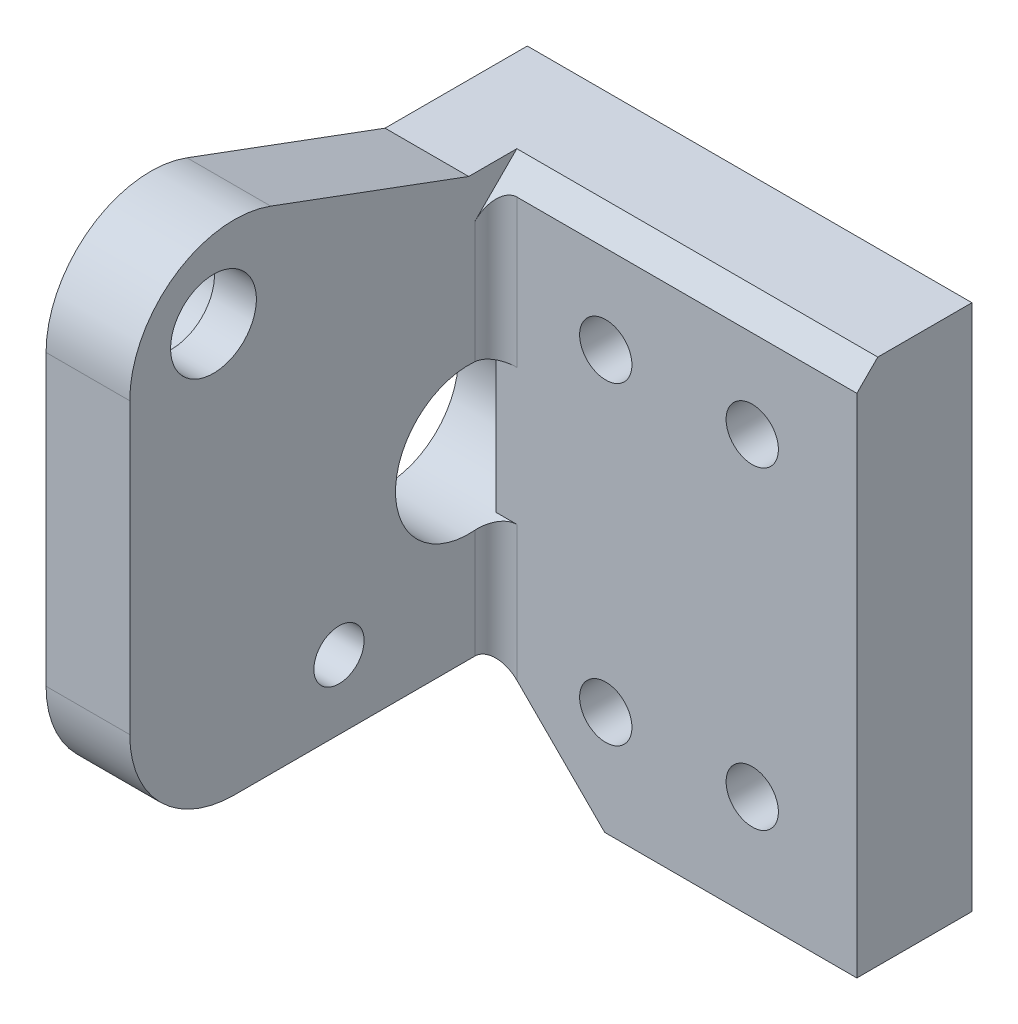
ISO-10303-21;
HEADER;
FILE_DESCRIPTION(('STEP AP214'),'2;1');
FILE_NAME('part.step','',(''),(''),'','','');
FILE_SCHEMA(('AUTOMOTIVE_DESIGN { 1 0 10303 214 1 1 1 1 }'));
ENDSEC;
DATA;
#1=APPLICATION_CONTEXT('core data for automotive mechanical design processes');
#2=APPLICATION_PROTOCOL_DEFINITION('international standard','automotive_design',2000,#1);
#3=PRODUCT_CONTEXT('',#1,'mechanical');
#4=PRODUCT('Part','Part','',(#3));
#5=PRODUCT_RELATED_PRODUCT_CATEGORY('part','',(#4));
#6=PRODUCT_DEFINITION_FORMATION('','',#4);
#7=PRODUCT_DEFINITION_CONTEXT('part definition',#1,'design');
#8=PRODUCT_DEFINITION('design','',#6,#7);
#9=PRODUCT_DEFINITION_SHAPE('','',#8);
#10=(LENGTH_UNIT() NAMED_UNIT(*) SI_UNIT(.MILLI.,.METRE.));
#11=(NAMED_UNIT(*) PLANE_ANGLE_UNIT() SI_UNIT($,.RADIAN.));
#12=(NAMED_UNIT(*) SI_UNIT($,.STERADIAN.) SOLID_ANGLE_UNIT());
#13=UNCERTAINTY_MEASURE_WITH_UNIT(LENGTH_MEASURE(1.E-05),#10,'distance_accuracy_value','');
#14=(GEOMETRIC_REPRESENTATION_CONTEXT(3) GLOBAL_UNCERTAINTY_ASSIGNED_CONTEXT((#13)) GLOBAL_UNIT_ASSIGNED_CONTEXT((#10,
#11,#12)) REPRESENTATION_CONTEXT('',''));
#15=CARTESIAN_POINT('',(0.,0.,0.));
#16=DIRECTION('',(0.,0.,1.));
#17=DIRECTION('',(1.,0.,0.));
#18=AXIS2_PLACEMENT_3D('',#15,#16,#17);
#19=CARTESIAN_POINT('',(-34.75,-12.,10.5));
#20=DIRECTION('',(0.,1.,0.));
#21=DIRECTION('',(0.,0.,1.));
#22=AXIS2_PLACEMENT_3D('',#19,#20,#21);
#23=PLANE('',#22);
#24=DIRECTION('',(0.,0.,1.));
#25=VECTOR('',#24,1.);
#26=CARTESIAN_POINT('',(-17.5,-12.,-61.));
#27=LINE('',#26,#25);
#28=CARTESIAN_POINT('',(-17.5,-12.,0.));
#29=VERTEX_POINT('',#28);
#30=CARTESIAN_POINT('',(-17.5,-12.,5.5));
#31=VERTEX_POINT('',#30);
#32=EDGE_CURVE('E170',#29,#31,#27,.T.);
#33=ORIENTED_EDGE('',*,*,#32,.T.);
#34=DIRECTION('',(1.,0.,0.));
#35=VECTOR('',#34,1.);
#36=CARTESIAN_POINT('',(-34.75,-12.,5.5));
#37=LINE('',#36,#35);
#38=CARTESIAN_POINT('',(-29.55,-12.,5.5));
#39=VERTEX_POINT('',#38);
#40=EDGE_CURVE('E150',#39,#31,#37,.T.);
#41=ORIENTED_EDGE('',*,*,#40,.F.);
#42=DIRECTION('',(0.,0.,-1.));
#43=VECTOR('',#42,1.);
#44=CARTESIAN_POINT('',(-29.55,-12.,10.5));
#45=LINE('',#44,#43);
#46=CARTESIAN_POINT('',(-29.55,-12.,0.));
#47=VERTEX_POINT('',#46);
#48=EDGE_CURVE('E179',#39,#47,#45,.T.);
#49=ORIENTED_EDGE('',*,*,#48,.T.);
#50=DIRECTION('',(1.,0.,0.));
#51=VECTOR('',#50,1.);
#52=CARTESIAN_POINT('',(-34.75,-12.,0.));
#53=LINE('',#52,#51);
#54=EDGE_CURVE('E178',#47,#29,#53,.T.);
#55=ORIENTED_EDGE('',*,*,#54,.T.);
#56=EDGE_LOOP('',(#33,#41,#49,#55));
#57=FACE_BOUND('',#56,.T.);
#58=ADVANCED_FACE('F38',(#57),#23,.F.);
#59=CARTESIAN_POINT('',(-34.75,13.2,10.5));
#60=DIRECTION('',(0.,-1.,0.));
#61=DIRECTION('',(0.,0.,-1.));
#62=AXIS2_PLACEMENT_3D('',#59,#60,#61);
#63=PLANE('',#62);
#64=DIRECTION('',(0.,0.,-1.));
#65=VECTOR('',#64,1.);
#66=CARTESIAN_POINT('',(-34.75,13.2000000000001,0.));
#67=LINE('',#66,#65);
#68=CARTESIAN_POINT('',(-34.75,13.2000000000001,6.79999999999993));
#69=VERTEX_POINT('',#68);
#70=CARTESIAN_POINT('',(-34.75,13.2,4.49999999999999));
#71=VERTEX_POINT('',#70);
#72=EDGE_CURVE('E388',#69,#71,#67,.T.);
#73=ORIENTED_EDGE('',*,*,#72,.T.);
#74=DIRECTION('',(1.,0.,0.));
#75=VECTOR('',#74,1.);
#76=CARTESIAN_POINT('',(-17.5,13.2,4.49999999999999));
#77=LINE('',#76,#75);
#78=CARTESIAN_POINT('',(-17.5,13.2,4.49999999999999));
#79=VERTEX_POINT('',#78);
#80=EDGE_CURVE('E223',#71,#79,#77,.T.);
#81=ORIENTED_EDGE('',*,*,#80,.T.);
#82=DIRECTION('',(0.,0.,-1.));
#83=VECTOR('',#82,1.);
#84=CARTESIAN_POINT('',(-17.5,13.2,10.5));
#85=LINE('',#84,#83);
#86=CARTESIAN_POINT('',(-17.5,13.2,0.));
#87=VERTEX_POINT('',#86);
#88=EDGE_CURVE('E411',#79,#87,#85,.T.);
#89=ORIENTED_EDGE('',*,*,#88,.T.);
#90=DIRECTION('',(1.,0.,0.));
#91=VECTOR('',#90,1.);
#92=CARTESIAN_POINT('',(-34.75,13.2,0.));
#93=LINE('',#92,#91);
#94=CARTESIAN_POINT('',(-38.75,13.2000000000001,0.));
#95=VERTEX_POINT('',#94);
#96=EDGE_CURVE('E191',#95,#87,#93,.T.);
#97=ORIENTED_EDGE('',*,*,#96,.F.);
#98=DIRECTION('',(0.,0.,-1.));
#99=VECTOR('',#98,1.);
#100=CARTESIAN_POINT('',(-38.75,13.2000000000001,0.));
#101=LINE('',#100,#99);
#102=CARTESIAN_POINT('',(-38.75,13.2000000000001,6.79999999999993));
#103=VERTEX_POINT('',#102);
#104=EDGE_CURVE('E393',#103,#95,#101,.T.);
#105=ORIENTED_EDGE('',*,*,#104,.F.);
#106=DIRECTION('',(1.,0.,0.));
#107=VECTOR('',#106,1.);
#108=CARTESIAN_POINT('',(-38.75,13.2000000000001,6.79999999999993));
#109=LINE('',#108,#107);
#110=EDGE_CURVE('E370',#103,#69,#109,.T.);
#111=ORIENTED_EDGE('',*,*,#110,.T.);
#112=EDGE_LOOP('',(#73,#81,#89,#97,#105,#111));
#113=FACE_BOUND('',#112,.T.);
#114=ADVANCED_FACE('F320',(#113),#63,.F.);
#115=CARTESIAN_POINT('',(-17.5,47.1283361405006,0.));
#116=DIRECTION('',(-1.,0.,0.));
#117=DIRECTION('',(0.,-1.,0.));
#118=AXIS2_PLACEMENT_3D('',#115,#116,#117);
#119=PLANE('',#118);
#120=ORIENTED_EDGE('',*,*,#88,.F.);
#121=DIRECTION('',(0.,-0.707106781186548,0.707106781186548));
#122=VECTOR('',#121,1.);
#123=CARTESIAN_POINT('',(-17.5,12.2,5.5));
#124=LINE('',#123,#122);
#125=CARTESIAN_POINT('',(-17.5,12.2,5.5));
#126=VERTEX_POINT('',#125);
#127=EDGE_CURVE('E173',#79,#126,#124,.T.);
#128=ORIENTED_EDGE('',*,*,#127,.T.);
#129=DIRECTION('',(0.,1.,0.));
#130=VECTOR('',#129,1.);
#131=CARTESIAN_POINT('',(-17.5,47.1283361405006,5.5));
#132=LINE('',#131,#130);
#133=EDGE_CURVE('E155',#31,#126,#132,.T.);
#134=ORIENTED_EDGE('',*,*,#133,.F.);
#135=ORIENTED_EDGE('',*,*,#32,.F.);
#136=DIRECTION('',(0.,-1.,0.));
#137=VECTOR('',#136,1.);
#138=CARTESIAN_POINT('',(-17.5,-12.,0.));
#139=LINE('',#138,#137);
#140=EDGE_CURVE('E187',#87,#29,#139,.T.);
#141=ORIENTED_EDGE('',*,*,#140,.F.);
#142=EDGE_LOOP('',(#120,#128,#134,#135,#141));
#143=FACE_BOUND('',#142,.T.);
#144=ADVANCED_FACE('F168',(#143),#119,.F.);
#145=CARTESIAN_POINT('',(-22.5,7.99999999999999,0.));
#146=DIRECTION('',(0.,0.,-1.));
#147=DIRECTION('',(-1.,0.,0.));
#148=AXIS2_PLACEMENT_3D('',#145,#146,#147);
#149=CYLINDRICAL_SURFACE('',#148,1.24999999999999);
#150=CARTESIAN_POINT('',(-22.5,7.99999999999999,0.499999999999998));
#151=DIRECTION('',(0.,0.,1.));
#152=DIRECTION('',(1.,0.,0.));
#153=AXIS2_PLACEMENT_3D('',#150,#151,#152);
#154=CIRCLE('',#153,1.24999999999999);
#155=CARTESIAN_POINT('',(-21.25,7.99999999999999,0.499999999999998));
#156=VERTEX_POINT('',#155);
#157=EDGE_CURVE('E430',#156,#156,#154,.F.);
#158=ORIENTED_EDGE('',*,*,#157,.T.);
#159=EDGE_LOOP('',(#158));
#160=FACE_BOUND('',#159,.T.);
#161=CARTESIAN_POINT('',(-22.5,7.99999999999999,5.5));
#162=DIRECTION('',(0.,0.,1.));
#163=DIRECTION('',(1.,0.,0.));
#164=AXIS2_PLACEMENT_3D('',#161,#162,#163);
#165=CIRCLE('',#164,1.24999999999999);
#166=CARTESIAN_POINT('',(-21.25,7.99999999999999,5.5));
#167=VERTEX_POINT('',#166);
#168=EDGE_CURVE('E442',#167,#167,#165,.F.);
#169=ORIENTED_EDGE('',*,*,#168,.F.);
#170=EDGE_LOOP('',(#169));
#171=FACE_BOUND('',#170,.T.);
#172=ADVANCED_FACE('F319',(#160,#171),#149,.F.);
#173=CARTESIAN_POINT('',(-22.5,-7.00000000000001,0.));
#174=DIRECTION('',(0.,0.,-1.));
#175=DIRECTION('',(-1.,0.,0.));
#176=AXIS2_PLACEMENT_3D('',#173,#174,#175);
#177=CYLINDRICAL_SURFACE('',#176,1.24999999999999);
#178=CARTESIAN_POINT('',(-22.5,-7.00000000000001,0.499999999999996));
#179=DIRECTION('',(0.,0.,1.));
#180=DIRECTION('',(1.,0.,0.));
#181=AXIS2_PLACEMENT_3D('',#178,#179,#180);
#182=CIRCLE('',#181,1.24999999999999);
#183=CARTESIAN_POINT('',(-21.25,-7.00000000000001,0.499999999999996));
#184=VERTEX_POINT('',#183);
#185=EDGE_CURVE('E197',#184,#184,#182,.F.);
#186=ORIENTED_EDGE('',*,*,#185,.T.);
#187=EDGE_LOOP('',(#186));
#188=FACE_BOUND('',#187,.T.);
#189=CARTESIAN_POINT('',(-22.5,-7.00000000000001,5.5));
#190=DIRECTION('',(0.,0.,1.));
#191=DIRECTION('',(1.,0.,0.));
#192=AXIS2_PLACEMENT_3D('',#189,#190,#191);
#193=CIRCLE('',#192,1.24999999999999);
#194=CARTESIAN_POINT('',(-21.25,-7.00000000000001,5.5));
#195=VERTEX_POINT('',#194);
#196=EDGE_CURVE('E174',#195,#195,#193,.F.);
#197=ORIENTED_EDGE('',*,*,#196,.F.);
#198=EDGE_LOOP('',(#197));
#199=FACE_BOUND('',#198,.T.);
#200=ADVANCED_FACE('F267',(#188,#199),#177,.F.);
#201=CARTESIAN_POINT('',(-38.75,13.2000000000001,18.9999999999999));
#202=DIRECTION('',(1.,0.,0.));
#203=DIRECTION('',(0.,0.,-1.));
#204=AXIS2_PLACEMENT_3D('',#201,#202,#203);
#205=CYLINDRICAL_SURFACE('',#204,2.04999999999995);
#206=CARTESIAN_POINT('',(-34.75,13.2000000000001,18.9999999999999));
#207=DIRECTION('',(-1.,0.,0.));
#208=DIRECTION('',(0.,0.,1.));
#209=AXIS2_PLACEMENT_3D('',#206,#207,#208);
#210=CIRCLE('',#209,2.04999999999995);
#211=CARTESIAN_POINT('',(-34.75,13.2000000000001,21.0499999999999));
#212=VERTEX_POINT('',#211);
#213=EDGE_CURVE('E376',#212,#212,#210,.T.);
#214=ORIENTED_EDGE('',*,*,#213,.F.);
#215=EDGE_LOOP('',(#214));
#216=FACE_BOUND('',#215,.T.);
#217=CARTESIAN_POINT('',(-36.75,13.2000000000001,18.9999999999999));
#218=DIRECTION('',(-1.,0.,0.));
#219=DIRECTION('',(0.,0.,1.));
#220=AXIS2_PLACEMENT_3D('',#217,#218,#219);
#221=CIRCLE('',#220,2.04999999999995);
#222=CARTESIAN_POINT('',(-36.75,13.2000000000001,21.0499999999999));
#223=VERTEX_POINT('',#222);
#224=EDGE_CURVE('E217',#223,#223,#221,.T.);
#225=ORIENTED_EDGE('',*,*,#224,.T.);
#226=EDGE_LOOP('',(#225));
#227=FACE_BOUND('',#226,.T.);
#228=ADVANCED_FACE('F262',(#216,#227),#205,.F.);
#229=CARTESIAN_POINT('',(-34.75,12.,10.5));
#230=DIRECTION('',(1.,0.,0.));
#231=DIRECTION('',(0.,0.,-1.));
#232=AXIS2_PLACEMENT_3D('',#229,#230,#231);
#233=PLANE('',#232);
#234=DIRECTION('',(0.,-1.,0.));
#235=VECTOR('',#234,1.);
#236=CARTESIAN_POINT('',(-34.75,12.,5.5));
#237=LINE('',#236,#235);
#238=CARTESIAN_POINT('',(-34.75,5.14961536185445,5.5));
#239=VERTEX_POINT('',#238);
#240=CARTESIAN_POINT('',(-34.75,-1.34961536185431,5.5));
#241=VERTEX_POINT('',#240);
#242=EDGE_CURVE('E164',#239,#241,#237,.T.);
#243=ORIENTED_EDGE('',*,*,#242,.F.);
#244=CARTESIAN_POINT('',(-34.75,1.90000000000007,6.79999999999993));
#245=DIRECTION('',(-1.,0.,0.));
#246=DIRECTION('',(0.,0.,1.));
#247=AXIS2_PLACEMENT_3D('',#244,#245,#246);
#248=CIRCLE('',#247,3.49999999999997);
#249=EDGE_CURVE('E367',#239,#241,#248,.T.);
#250=ORIENTED_EDGE('',*,*,#249,.T.);
#251=EDGE_LOOP('',(#243,#250));
#252=FACE_BOUND('',#251,.T.);
#253=ADVANCED_FACE('F266',(#252),#233,.F.);
#254=CARTESIAN_POINT('',(-29.5,7.99999999999998,0.));
#255=DIRECTION('',(0.,0.,-1.));
#256=DIRECTION('',(-1.,0.,0.));
#257=AXIS2_PLACEMENT_3D('',#254,#255,#256);
#258=CYLINDRICAL_SURFACE('',#257,1.24999999999999);
#259=CARTESIAN_POINT('',(-29.5,7.99999999999998,0.499999999999998));
#260=DIRECTION('',(0.,0.,1.));
#261=DIRECTION('',(1.,0.,0.));
#262=AXIS2_PLACEMENT_3D('',#259,#260,#261);
#263=CIRCLE('',#262,1.24999999999999);
#264=CARTESIAN_POINT('',(-28.25,7.99999999999998,0.499999999999998));
#265=VERTEX_POINT('',#264);
#266=EDGE_CURVE('E416',#265,#265,#263,.F.);
#267=ORIENTED_EDGE('',*,*,#266,.T.);
#268=EDGE_LOOP('',(#267));
#269=FACE_BOUND('',#268,.T.);
#270=CARTESIAN_POINT('',(-29.5,7.99999999999998,5.5));
#271=DIRECTION('',(0.,0.,1.));
#272=DIRECTION('',(1.,0.,0.));
#273=AXIS2_PLACEMENT_3D('',#270,#271,#272);
#274=CIRCLE('',#273,1.24999999999999);
#275=CARTESIAN_POINT('',(-28.25,7.99999999999998,5.5));
#276=VERTEX_POINT('',#275);
#277=EDGE_CURVE('E180',#276,#276,#274,.F.);
#278=ORIENTED_EDGE('',*,*,#277,.F.);
#279=EDGE_LOOP('',(#278));
#280=FACE_BOUND('',#279,.T.);
#281=ADVANCED_FACE('F315',(#269,#280),#258,.F.);
#282=CARTESIAN_POINT('',(-29.5,-7.00000000000001,0.));
#283=DIRECTION('',(0.,0.,-1.));
#284=DIRECTION('',(-1.,0.,0.));
#285=AXIS2_PLACEMENT_3D('',#282,#283,#284);
#286=CYLINDRICAL_SURFACE('',#285,1.24999999999999);
#287=CARTESIAN_POINT('',(-29.5,-7.00000000000001,0.499999999999998));
#288=DIRECTION('',(0.,0.,1.));
#289=DIRECTION('',(1.,0.,0.));
#290=AXIS2_PLACEMENT_3D('',#287,#288,#289);
#291=CIRCLE('',#290,1.24999999999999);
#292=CARTESIAN_POINT('',(-28.25,-7.00000000000001,0.499999999999998));
#293=VERTEX_POINT('',#292);
#294=EDGE_CURVE('E421',#293,#293,#291,.F.);
#295=ORIENTED_EDGE('',*,*,#294,.T.);
#296=EDGE_LOOP('',(#295));
#297=FACE_BOUND('',#296,.T.);
#298=CARTESIAN_POINT('',(-29.5,-7.00000000000001,5.5));
#299=DIRECTION('',(0.,0.,1.));
#300=DIRECTION('',(1.,0.,0.));
#301=AXIS2_PLACEMENT_3D('',#298,#299,#300);
#302=CIRCLE('',#301,1.24999999999999);
#303=CARTESIAN_POINT('',(-28.25,-7.00000000000001,5.5));
#304=VERTEX_POINT('',#303);
#305=EDGE_CURVE('E163',#304,#304,#302,.F.);
#306=ORIENTED_EDGE('',*,*,#305,.F.);
#307=EDGE_LOOP('',(#306));
#308=FACE_BOUND('',#307,.T.);
#309=ADVANCED_FACE('F296',(#297,#308),#286,.F.);
#310=CARTESIAN_POINT('',(-29.55,-12.,10.5));
#311=DIRECTION('',(0.707106781186549,0.707106781186546,0.));
#312=DIRECTION('',(-0.707106781186546,0.707106781186549,0.));
#313=AXIS2_PLACEMENT_3D('',#310,#311,#312);
#314=PLANE('',#313);
#315=ORIENTED_EDGE('',*,*,#48,.F.);
#316=DIRECTION('',(0.707106781186546,-0.707106781186549,0.));
#317=VECTOR('',#316,1.);
#318=CARTESIAN_POINT('',(-29.55,-12.,5.5));
#319=LINE('',#318,#317);
#320=CARTESIAN_POINT('',(-33.75,-7.79999999999999,5.5));
#321=VERTEX_POINT('',#320);
#322=EDGE_CURVE('E159',#39,#321,#319,.F.);
#323=ORIENTED_EDGE('',*,*,#322,.T.);
#324=CARTESIAN_POINT('',(-33.75,-7.79999999999999,6.5));
#325=DIRECTION('',(0.707106781186549,0.707106781186546,0.));
#326=DIRECTION('',(-0.707106781186546,0.707106781186549,0.));
#327=AXIS2_PLACEMENT_3D('',#324,#325,#326);
#328=ELLIPSE('',#327,1.4142135623731,1.);
#329=CARTESIAN_POINT('',(-34.75,-6.79999999999993,6.5));
#330=VERTEX_POINT('',#329);
#331=EDGE_CURVE('E53',#321,#330,#328,.T.);
#332=ORIENTED_EDGE('',*,*,#331,.T.);
#333=DIRECTION('',(0.,0.,1.));
#334=VECTOR('',#333,1.);
#335=CARTESIAN_POINT('',(-34.75,-6.79999999999998,10.5));
#336=LINE('',#335,#334);
#337=CARTESIAN_POINT('',(-34.75,-6.79999999999993,0.));
#338=VERTEX_POINT('',#337);
#339=EDGE_CURVE('E413',#338,#330,#336,.T.);
#340=ORIENTED_EDGE('',*,*,#339,.F.);
#341=DIRECTION('',(0.707106781186546,-0.707106781186549,0.));
#342=VECTOR('',#341,1.);
#343=CARTESIAN_POINT('',(-29.55,-12.,0.));
#344=LINE('',#343,#342);
#345=EDGE_CURVE('E414',#47,#338,#344,.F.);
#346=ORIENTED_EDGE('',*,*,#345,.F.);
#347=EDGE_LOOP('',(#315,#323,#332,#340,#346));
#348=FACE_BOUND('',#347,.T.);
#349=ADVANCED_FACE('F292',(#348),#314,.F.);
#350=CARTESIAN_POINT('',(-34.75,-12.,0.));
#351=DIRECTION('',(0.,0.,1.));
#352=DIRECTION('',(1.,0.,0.));
#353=AXIS2_PLACEMENT_3D('',#350,#351,#352);
#354=PLANE('',#353);
#355=CARTESIAN_POINT('',(-22.5,-7.00000000000001,0.));
#356=DIRECTION('',(0.,0.,1.));
#357=DIRECTION('',(1.,0.,0.));
#358=AXIS2_PLACEMENT_3D('',#355,#356,#357);
#359=CIRCLE('',#358,1.74999999999999);
#360=CARTESIAN_POINT('',(-20.75,-7.00000000000001,0.));
#361=VERTEX_POINT('',#360);
#362=EDGE_CURVE('E190',#361,#361,#359,.T.);
#363=ORIENTED_EDGE('',*,*,#362,.T.);
#364=EDGE_LOOP('',(#363));
#365=FACE_BOUND('',#364,.T.);
#366=CARTESIAN_POINT('',(-22.5,7.99999999999999,0.));
#367=DIRECTION('',(0.,0.,1.));
#368=DIRECTION('',(1.,0.,0.));
#369=AXIS2_PLACEMENT_3D('',#366,#367,#368);
#370=CIRCLE('',#369,1.74999999999999);
#371=CARTESIAN_POINT('',(-20.75,7.99999999999999,0.));
#372=VERTEX_POINT('',#371);
#373=EDGE_CURVE('E427',#372,#372,#370,.T.);
#374=ORIENTED_EDGE('',*,*,#373,.T.);
#375=EDGE_LOOP('',(#374));
#376=FACE_BOUND('',#375,.T.);
#377=CARTESIAN_POINT('',(-29.5,7.99999999999998,0.));
#378=DIRECTION('',(0.,0.,1.));
#379=DIRECTION('',(1.,0.,0.));
#380=AXIS2_PLACEMENT_3D('',#377,#378,#379);
#381=CIRCLE('',#380,1.74999999999999);
#382=CARTESIAN_POINT('',(-27.75,7.99999999999998,0.));
#383=VERTEX_POINT('',#382);
#384=EDGE_CURVE('E424',#383,#383,#381,.T.);
#385=ORIENTED_EDGE('',*,*,#384,.T.);
#386=EDGE_LOOP('',(#385));
#387=FACE_BOUND('',#386,.T.);
#388=CARTESIAN_POINT('',(-29.5,-7.00000000000001,0.));
#389=DIRECTION('',(0.,0.,1.));
#390=DIRECTION('',(1.,0.,0.));
#391=AXIS2_PLACEMENT_3D('',#388,#389,#390);
#392=CIRCLE('',#391,1.74999999999999);
#393=CARTESIAN_POINT('',(-27.75,-7.00000000000001,0.));
#394=VERTEX_POINT('',#393);
#395=EDGE_CURVE('E194',#394,#394,#392,.T.);
#396=ORIENTED_EDGE('',*,*,#395,.T.);
#397=EDGE_LOOP('',(#396));
#398=FACE_BOUND('',#397,.T.);
#399=ORIENTED_EDGE('',*,*,#96,.T.);
#400=ORIENTED_EDGE('',*,*,#140,.T.);
#401=ORIENTED_EDGE('',*,*,#54,.F.);
#402=ORIENTED_EDGE('',*,*,#345,.T.);
#403=DIRECTION('',(1.,0.,0.));
#404=VECTOR('',#403,1.);
#405=CARTESIAN_POINT('',(-38.75,-6.79999999999993,0.));
#406=LINE('',#405,#404);
#407=CARTESIAN_POINT('',(-38.75,-6.79999999999993,0.));
#408=VERTEX_POINT('',#407);
#409=EDGE_CURVE('E398',#408,#338,#406,.T.);
#410=ORIENTED_EDGE('',*,*,#409,.F.);
#411=DIRECTION('',(0.,-1.,0.));
#412=VECTOR('',#411,1.);
#413=CARTESIAN_POINT('',(-38.75,-6.79999999999993,0.));
#414=LINE('',#413,#412);
#415=EDGE_CURVE('E396',#95,#408,#414,.T.);
#416=ORIENTED_EDGE('',*,*,#415,.F.);
#417=EDGE_LOOP('',(#399,#400,#401,#402,#410,#416));
#418=FACE_BOUND('',#417,.T.);
#419=ADVANCED_FACE('F295',(#365,#376,#387,#398,#418),#354,.F.);
#420=CARTESIAN_POINT('',(-22.5,7.99999999999999,0.499999999999998));
#421=DIRECTION('',(0.,0.,-1.));
#422=DIRECTION('',(-1.,0.,0.));
#423=AXIS2_PLACEMENT_3D('',#420,#421,#422);
#424=CONICAL_SURFACE('',#423,1.24999999999999,0.785398163397451);
#425=ORIENTED_EDGE('',*,*,#373,.F.);
#426=EDGE_LOOP('',(#425));
#427=FACE_BOUND('',#426,.T.);
#428=ORIENTED_EDGE('',*,*,#157,.F.);
#429=EDGE_LOOP('',(#428));
#430=FACE_BOUND('',#429,.T.);
#431=ADVANCED_FACE('F308',(#427,#430),#424,.F.);
#432=CARTESIAN_POINT('',(-22.5,-7.00000000000001,0.499999999999996));
#433=DIRECTION('',(0.,0.,-1.));
#434=DIRECTION('',(-1.,0.,0.));
#435=AXIS2_PLACEMENT_3D('',#432,#433,#434);
#436=CONICAL_SURFACE('',#435,1.24999999999999,0.785398163397454);
#437=ORIENTED_EDGE('',*,*,#362,.F.);
#438=EDGE_LOOP('',(#437));
#439=FACE_BOUND('',#438,.T.);
#440=ORIENTED_EDGE('',*,*,#185,.F.);
#441=EDGE_LOOP('',(#440));
#442=FACE_BOUND('',#441,.T.);
#443=ADVANCED_FACE('F304',(#439,#442),#436,.F.);
#444=CARTESIAN_POINT('',(-29.5,-7.00000000000001,0.499999999999998));
#445=DIRECTION('',(0.,0.,-1.));
#446=DIRECTION('',(-1.,0.,0.));
#447=AXIS2_PLACEMENT_3D('',#444,#445,#446);
#448=CONICAL_SURFACE('',#447,1.24999999999999,0.785398163397451);
#449=ORIENTED_EDGE('',*,*,#395,.F.);
#450=EDGE_LOOP('',(#449));
#451=FACE_BOUND('',#450,.T.);
#452=ORIENTED_EDGE('',*,*,#294,.F.);
#453=EDGE_LOOP('',(#452));
#454=FACE_BOUND('',#453,.T.);
#455=ADVANCED_FACE('F300',(#451,#454),#448,.F.);
#456=CARTESIAN_POINT('',(-29.5,7.99999999999998,0.499999999999998));
#457=DIRECTION('',(0.,0.,-1.));
#458=DIRECTION('',(-1.,0.,0.));
#459=AXIS2_PLACEMENT_3D('',#456,#457,#458);
#460=CONICAL_SURFACE('',#459,1.24999999999999,0.785398163397451);
#461=ORIENTED_EDGE('',*,*,#384,.F.);
#462=EDGE_LOOP('',(#461));
#463=FACE_BOUND('',#462,.T.);
#464=ORIENTED_EDGE('',*,*,#266,.F.);
#465=EDGE_LOOP('',(#464));
#466=FACE_BOUND('',#465,.T.);
#467=ADVANCED_FACE('F290',(#463,#466),#460,.F.);
#468=CARTESIAN_POINT('',(0.,0.,5.5));
#469=DIRECTION('',(0.,0.,1.));
#470=DIRECTION('',(1.,0.,0.));
#471=AXIS2_PLACEMENT_3D('',#468,#469,#470);
#472=PLANE('',#471);
#473=ORIENTED_EDGE('',*,*,#277,.T.);
#474=EDGE_LOOP('',(#473));
#475=FACE_BOUND('',#474,.T.);
#476=ORIENTED_EDGE('',*,*,#305,.T.);
#477=EDGE_LOOP('',(#476));
#478=FACE_BOUND('',#477,.T.);
#479=DIRECTION('',(-1.,0.,0.));
#480=VECTOR('',#479,1.);
#481=CARTESIAN_POINT('',(-34.75,12.2,5.5));
#482=LINE('',#481,#480);
#483=CARTESIAN_POINT('',(-33.75,12.2,5.5));
#484=VERTEX_POINT('',#483);
#485=EDGE_CURVE('E216',#126,#484,#482,.T.);
#486=ORIENTED_EDGE('',*,*,#485,.T.);
#487=DIRECTION('',(0.,-1.,0.));
#488=VECTOR('',#487,1.);
#489=CARTESIAN_POINT('',(-33.75,5.14961536185445,5.5));
#490=LINE('',#489,#488);
#491=CARTESIAN_POINT('',(-33.75,5.14961536185445,5.5));
#492=VERTEX_POINT('',#491);
#493=EDGE_CURVE('E234',#484,#492,#490,.T.);
#494=ORIENTED_EDGE('',*,*,#493,.T.);
#495=DIRECTION('',(1.,0.,0.));
#496=VECTOR('',#495,1.);
#497=CARTESIAN_POINT('',(-33.75,5.14961536185445,5.5));
#498=LINE('',#497,#496);
#499=EDGE_CURVE('E232',#492,#239,#498,.F.);
#500=ORIENTED_EDGE('',*,*,#499,.T.);
#501=ORIENTED_EDGE('',*,*,#242,.T.);
#502=DIRECTION('',(1.,0.,0.));
#503=VECTOR('',#502,1.);
#504=CARTESIAN_POINT('',(-34.75,-1.34961536185431,5.5));
#505=LINE('',#504,#503);
#506=CARTESIAN_POINT('',(-33.75,-1.34961536185431,5.5));
#507=VERTEX_POINT('',#506);
#508=EDGE_CURVE('E58',#241,#507,#505,.T.);
#509=ORIENTED_EDGE('',*,*,#508,.T.);
#510=DIRECTION('',(0.,-1.,0.));
#511=VECTOR('',#510,1.);
#512=CARTESIAN_POINT('',(-33.75,-6.79999999999993,5.5));
#513=LINE('',#512,#511);
#514=EDGE_CURVE('E230',#507,#321,#513,.T.);
#515=ORIENTED_EDGE('',*,*,#514,.T.);
#516=ORIENTED_EDGE('',*,*,#322,.F.);
#517=ORIENTED_EDGE('',*,*,#40,.T.);
#518=ORIENTED_EDGE('',*,*,#133,.T.);
#519=EDGE_LOOP('',(#486,#494,#500,#501,#509,#515,#516,#517,#518));
#520=FACE_BOUND('',#519,.T.);
#521=ORIENTED_EDGE('',*,*,#196,.T.);
#522=EDGE_LOOP('',(#521));
#523=FACE_BOUND('',#522,.T.);
#524=ORIENTED_EDGE('',*,*,#168,.T.);
#525=EDGE_LOOP('',(#524));
#526=FACE_BOUND('',#525,.T.);
#527=ADVANCED_FACE('F153',(#475,#478,#520,#523,#526),#472,.T.);
#528=CARTESIAN_POINT('',(-34.75,0.,0.));
#529=DIRECTION('',(1.,0.,0.));
#530=DIRECTION('',(0.,0.,-1.));
#531=AXIS2_PLACEMENT_3D('',#528,#529,#530);
#532=PLANE('',#531);
#533=CARTESIAN_POINT('',(-34.75,-3.49999999999993,12.9999999999999));
#534=DIRECTION('',(1.,0.,0.));
#535=DIRECTION('',(0.,0.,-1.));
#536=AXIS2_PLACEMENT_3D('',#533,#534,#535);
#537=CIRCLE('',#536,1.19999999999999);
#538=CARTESIAN_POINT('',(-34.75,-3.49999999999993,11.7999999999999));
#539=VERTEX_POINT('',#538);
#540=EDGE_CURVE('E378',#539,#539,#537,.T.);
#541=ORIENTED_EDGE('',*,*,#540,.F.);
#542=EDGE_LOOP('',(#541));
#543=FACE_BOUND('',#542,.T.);
#544=ORIENTED_EDGE('',*,*,#213,.T.);
#545=EDGE_LOOP('',(#544));
#546=FACE_BOUND('',#545,.T.);
#547=CARTESIAN_POINT('',(-34.75,-1.58711915483244,6.5));
#548=VERTEX_POINT('',#547);
#549=CARTESIAN_POINT('',(-34.75,5.38711915483258,6.5));
#550=VERTEX_POINT('',#549);
#551=EDGE_CURVE('E373',#548,#550,#248,.T.);
#552=ORIENTED_EDGE('',*,*,#551,.T.);
#553=DIRECTION('',(0.,-1.,0.));
#554=VECTOR('',#553,1.);
#555=CARTESIAN_POINT('',(-34.75,12.2,6.5));
#556=LINE('',#555,#554);
#557=CARTESIAN_POINT('',(-34.75,11.2,6.5));
#558=VERTEX_POINT('',#557);
#559=EDGE_CURVE('E239',#550,#558,#556,.F.);
#560=ORIENTED_EDGE('',*,*,#559,.T.);
#561=DIRECTION('',(0.,0.707106781186548,-0.707106781186548));
#562=VECTOR('',#561,1.);
#563=CARTESIAN_POINT('',(-34.75,12.2,5.5));
#564=LINE('',#563,#562);
#565=EDGE_CURVE('E226',#558,#71,#564,.T.);
#566=ORIENTED_EDGE('',*,*,#565,.T.);
#567=ORIENTED_EDGE('',*,*,#72,.F.);
#568=DIRECTION('',(0.,-0.347314355823594,-0.937748760723704));
#569=VECTOR('',#568,1.);
#570=CARTESIAN_POINT('',(-34.75,13.2000000000001,6.79999999999993));
#571=LINE('',#570,#569);
#572=CARTESIAN_POINT('',(-34.75,16.7049734151416,16.263428220882));
#573=VERTEX_POINT('',#572);
#574=EDGE_CURVE('E403',#573,#69,#571,.T.);
#575=ORIENTED_EDGE('',*,*,#574,.F.);
#576=CARTESIAN_POINT('',(-34.75,12.016229611523,17.9999999999999));
#577=DIRECTION('',(1.,0.,0.));
#578=DIRECTION('',(0.,0.,-1.));
#579=AXIS2_PLACEMENT_3D('',#576,#577,#578);
#580=CIRCLE('',#579,5.);
#581=CARTESIAN_POINT('',(-34.75,12.016229611523,22.9999999999999));
#582=VERTEX_POINT('',#581);
#583=EDGE_CURVE('E202',#573,#582,#580,.T.);
#584=ORIENTED_EDGE('',*,*,#583,.T.);
#585=DIRECTION('',(0.,1.,0.));
#586=VECTOR('',#585,1.);
#587=CARTESIAN_POINT('',(-34.75,-6.79999999999993,22.9999999999999));
#588=LINE('',#587,#586);
#589=CARTESIAN_POINT('',(-34.75,-1.79999999999993,22.9999999999999));
#590=VERTEX_POINT('',#589);
#591=EDGE_CURVE('E400',#590,#582,#588,.T.);
#592=ORIENTED_EDGE('',*,*,#591,.F.);
#593=CARTESIAN_POINT('',(-34.75,-1.79999999999993,17.9999999999999));
#594=DIRECTION('',(1.,0.,0.));
#595=DIRECTION('',(0.,0.,-1.));
#596=AXIS2_PLACEMENT_3D('',#593,#594,#595);
#597=CIRCLE('',#596,5.);
#598=CARTESIAN_POINT('',(-34.75,-6.79999999999993,17.9999999999999));
#599=VERTEX_POINT('',#598);
#600=EDGE_CURVE('E204',#590,#599,#597,.T.);
#601=ORIENTED_EDGE('',*,*,#600,.T.);
#602=DIRECTION('',(0.,0.,1.));
#603=VECTOR('',#602,1.);
#604=CARTESIAN_POINT('',(-34.75,-6.79999999999993,22.9999999999999));
#605=LINE('',#604,#603);
#606=EDGE_CURVE('E383',#330,#599,#605,.T.);
#607=ORIENTED_EDGE('',*,*,#606,.F.);
#608=DIRECTION('',(0.,-1.,0.));
#609=VECTOR('',#608,1.);
#610=CARTESIAN_POINT('',(-34.75,-1.34961536185431,6.5));
#611=LINE('',#610,#609);
#612=EDGE_CURVE('E237',#330,#548,#611,.F.);
#613=ORIENTED_EDGE('',*,*,#612,.T.);
#614=EDGE_LOOP('',(#552,#560,#566,#567,#575,#584,#592,#601,#607,#613));
#615=FACE_BOUND('',#614,.T.);
#616=ADVANCED_FACE('F273',(#543,#546,#615),#532,.T.);
#617=CARTESIAN_POINT('',(-38.75,0.,0.));
#618=DIRECTION('',(1.,0.,0.));
#619=DIRECTION('',(0.,0.,-1.));
#620=AXIS2_PLACEMENT_3D('',#617,#618,#619);
#621=PLANE('',#620);
#622=CARTESIAN_POINT('',(-38.75,13.2000000000001,18.9999999999999));
#623=DIRECTION('',(-1.,0.,0.));
#624=DIRECTION('',(0.,0.,1.));
#625=AXIS2_PLACEMENT_3D('',#622,#623,#624);
#626=CIRCLE('',#625,2.4);
#627=CARTESIAN_POINT('',(-38.75,13.2000000000001,21.3999999999999));
#628=VERTEX_POINT('',#627);
#629=EDGE_CURVE('E444',#628,#628,#626,.T.);
#630=ORIENTED_EDGE('',*,*,#629,.F.);
#631=EDGE_LOOP('',(#630));
#632=FACE_BOUND('',#631,.T.);
#633=CARTESIAN_POINT('',(-38.75,-3.49999999999993,12.9999999999999));
#634=DIRECTION('',(-1.,0.,0.));
#635=DIRECTION('',(0.,0.,1.));
#636=AXIS2_PLACEMENT_3D('',#633,#634,#635);
#637=CIRCLE('',#636,2.25);
#638=CARTESIAN_POINT('',(-38.75,-3.49999999999993,15.2499999999999));
#639=VERTEX_POINT('',#638);
#640=EDGE_CURVE('E220',#639,#639,#637,.T.);
#641=ORIENTED_EDGE('',*,*,#640,.F.);
#642=EDGE_LOOP('',(#641));
#643=FACE_BOUND('',#642,.T.);
#644=DIRECTION('',(0.,0.,1.));
#645=VECTOR('',#644,1.);
#646=CARTESIAN_POINT('',(-38.75,-6.79999999999993,22.9999999999999));
#647=LINE('',#646,#645);
#648=CARTESIAN_POINT('',(-38.75,-6.79999999999993,17.9999999999999));
#649=VERTEX_POINT('',#648);
#650=EDGE_CURVE('E384',#408,#649,#647,.T.);
#651=ORIENTED_EDGE('',*,*,#650,.T.);
#652=CARTESIAN_POINT('',(-38.75,-1.79999999999993,17.9999999999999));
#653=DIRECTION('',(1.,0.,0.));
#654=DIRECTION('',(0.,0.,-1.));
#655=AXIS2_PLACEMENT_3D('',#652,#653,#654);
#656=CIRCLE('',#655,5.);
#657=CARTESIAN_POINT('',(-38.75,-1.79999999999993,22.9999999999999));
#658=VERTEX_POINT('',#657);
#659=EDGE_CURVE('E211',#649,#658,#656,.F.);
#660=ORIENTED_EDGE('',*,*,#659,.T.);
#661=DIRECTION('',(0.,1.,0.));
#662=VECTOR('',#661,1.);
#663=CARTESIAN_POINT('',(-38.75,-6.79999999999993,22.9999999999999));
#664=LINE('',#663,#662);
#665=CARTESIAN_POINT('',(-38.75,12.016229611523,22.9999999999999));
#666=VERTEX_POINT('',#665);
#667=EDGE_CURVE('E387',#658,#666,#664,.T.);
#668=ORIENTED_EDGE('',*,*,#667,.T.);
#669=CARTESIAN_POINT('',(-38.75,12.016229611523,17.9999999999999));
#670=DIRECTION('',(1.,0.,0.));
#671=DIRECTION('',(0.,0.,-1.));
#672=AXIS2_PLACEMENT_3D('',#669,#670,#671);
#673=CIRCLE('',#672,5.);
#674=CARTESIAN_POINT('',(-38.75,16.7049734151416,16.263428220882));
#675=VERTEX_POINT('',#674);
#676=EDGE_CURVE('E209',#666,#675,#673,.F.);
#677=ORIENTED_EDGE('',*,*,#676,.T.);
#678=DIRECTION('',(0.,-0.347314355823594,-0.937748760723704));
#679=VECTOR('',#678,1.);
#680=CARTESIAN_POINT('',(-38.75,13.2000000000001,6.79999999999993));
#681=LINE('',#680,#679);
#682=EDGE_CURVE('E391',#675,#103,#681,.T.);
#683=ORIENTED_EDGE('',*,*,#682,.T.);
#684=ORIENTED_EDGE('',*,*,#104,.T.);
#685=ORIENTED_EDGE('',*,*,#415,.T.);
#686=EDGE_LOOP('',(#651,#660,#668,#677,#683,#684,#685));
#687=FACE_BOUND('',#686,.T.);
#688=CARTESIAN_POINT('',(-38.75,1.90000000000007,6.79999999999993));
#689=DIRECTION('',(-1.,0.,0.));
#690=DIRECTION('',(0.,0.,1.));
#691=AXIS2_PLACEMENT_3D('',#688,#689,#690);
#692=CIRCLE('',#691,3.49999999999997);
#693=CARTESIAN_POINT('',(-38.75,1.90000000000007,10.2999999999999));
#694=VERTEX_POINT('',#693);
#695=EDGE_CURVE('E372',#694,#694,#692,.T.);
#696=ORIENTED_EDGE('',*,*,#695,.F.);
#697=EDGE_LOOP('',(#696));
#698=FACE_BOUND('',#697,.T.);
#699=ADVANCED_FACE('F269',(#632,#643,#687,#698),#621,.F.);
#700=CARTESIAN_POINT('',(-38.75,-6.79999999999993,22.9999999999999));
#701=DIRECTION('',(0.,1.,0.));
#702=DIRECTION('',(0.,0.,1.));
#703=AXIS2_PLACEMENT_3D('',#700,#701,#702);
#704=PLANE('',#703);
#705=ORIENTED_EDGE('',*,*,#339,.T.);
#706=ORIENTED_EDGE('',*,*,#606,.T.);
#707=DIRECTION('',(1.,0.,0.));
#708=VECTOR('',#707,1.);
#709=CARTESIAN_POINT('',(-38.75,-6.79999999999993,17.9999999999999));
#710=LINE('',#709,#708);
#711=EDGE_CURVE('E207',#599,#649,#710,.F.);
#712=ORIENTED_EDGE('',*,*,#711,.T.);
#713=ORIENTED_EDGE('',*,*,#650,.F.);
#714=ORIENTED_EDGE('',*,*,#409,.T.);
#715=EDGE_LOOP('',(#705,#706,#712,#713,#714));
#716=FACE_BOUND('',#715,.T.);
#717=ADVANCED_FACE('F272',(#716),#704,.F.);
#718=CARTESIAN_POINT('',(-38.75,-6.79999999999993,22.9999999999999));
#719=DIRECTION('',(0.,0.,-1.));
#720=DIRECTION('',(-1.,0.,0.));
#721=AXIS2_PLACEMENT_3D('',#718,#719,#720);
#722=PLANE('',#721);
#723=ORIENTED_EDGE('',*,*,#667,.F.);
#724=DIRECTION('',(1.,0.,0.));
#725=VECTOR('',#724,1.);
#726=CARTESIAN_POINT('',(-38.75,-1.79999999999993,22.9999999999999));
#727=LINE('',#726,#725);
#728=EDGE_CURVE('E199',#658,#590,#727,.T.);
#729=ORIENTED_EDGE('',*,*,#728,.T.);
#730=ORIENTED_EDGE('',*,*,#591,.T.);
#731=DIRECTION('',(1.,0.,0.));
#732=VECTOR('',#731,1.);
#733=CARTESIAN_POINT('',(-38.75,12.016229611523,22.9999999999999));
#734=LINE('',#733,#732);
#735=EDGE_CURVE('E196',#582,#666,#734,.F.);
#736=ORIENTED_EDGE('',*,*,#735,.T.);
#737=EDGE_LOOP('',(#723,#729,#730,#736));
#738=FACE_BOUND('',#737,.T.);
#739=ADVANCED_FACE('F280',(#738),#722,.F.);
#740=CARTESIAN_POINT('',(-38.75,13.2000000000001,6.79999999999993));
#741=DIRECTION('',(0.,-0.937748760723704,0.347314355823594));
#742=DIRECTION('',(0.,-0.347314355823594,-0.937748760723704));
#743=AXIS2_PLACEMENT_3D('',#740,#741,#742);
#744=PLANE('',#743);
#745=ORIENTED_EDGE('',*,*,#682,.F.);
#746=DIRECTION('',(1.,0.,0.));
#747=VECTOR('',#746,1.);
#748=CARTESIAN_POINT('',(-38.75,16.7049734151416,16.263428220882));
#749=LINE('',#748,#747);
#750=EDGE_CURVE('E213',#675,#573,#749,.T.);
#751=ORIENTED_EDGE('',*,*,#750,.T.);
#752=ORIENTED_EDGE('',*,*,#574,.T.);
#753=ORIENTED_EDGE('',*,*,#110,.F.);
#754=EDGE_LOOP('',(#745,#751,#752,#753));
#755=FACE_BOUND('',#754,.T.);
#756=ADVANCED_FACE('F258',(#755),#744,.F.);
#757=CARTESIAN_POINT('',(-38.75,1.90000000000007,6.79999999999993));
#758=DIRECTION('',(1.,0.,0.));
#759=DIRECTION('',(0.,0.,-1.));
#760=AXIS2_PLACEMENT_3D('',#757,#758,#759);
#761=CYLINDRICAL_SURFACE('',#760,3.49999999999997);
#762=ORIENTED_EDGE('',*,*,#695,.T.);
#763=EDGE_LOOP('',(#762));
#764=FACE_BOUND('',#763,.T.);
#765=ORIENTED_EDGE('',*,*,#249,.F.);
#766=ORIENTED_EDGE('',*,*,#499,.F.);
#767=CARTESIAN_POINT('',(-33.75,5.14961536185445,5.5));
#768=CARTESIAN_POINT('',(-33.7769988909983,5.1496128862752,5.49999906334968));
#769=CARTESIAN_POINT('',(-33.803983874897,5.15005327495871,5.50109413104696));
#770=CARTESIAN_POINT('',(-33.8577419526121,5.15179374631036,5.50545540389807));
#771=CARTESIAN_POINT('',(-33.8845151073883,5.1530935718155,5.50872095959412));
#772=CARTESIAN_POINT('',(-33.9640380234204,5.15822891362533,5.52170597281717));
#773=CARTESIAN_POINT('',(-34.0162248497971,5.16330074683225,5.53461419778192));
#774=CARTESIAN_POINT('',(-34.1174835762092,5.17621362190188,5.56843729891212));
#775=CARTESIAN_POINT('',(-34.166557562794,5.1840527851691,5.58934674427467));
#776=CARTESIAN_POINT('',(-34.2605193306049,5.20175674933768,5.63849964087072));
#777=CARTESIAN_POINT('',(-34.3054040571083,5.21162301183354,5.66674838785298));
#778=CARTESIAN_POINT('',(-34.3917517710469,5.23297042955415,5.73112089761494));
#779=CARTESIAN_POINT('',(-34.4329937778507,5.24450179647188,5.76752411535514));
#780=CARTESIAN_POINT('',(-34.5089407393932,5.26787850053714,5.84653762896405));
#781=CARTESIAN_POINT('',(-34.5436435588698,5.27972393880413,5.88914994428309));
#782=CARTESIAN_POINT('',(-34.6071241685027,5.30334733769798,5.98170330823718));
#783=CARTESIAN_POINT('',(-34.6355509793959,5.31509649297082,6.03189316221943));
#784=CARTESIAN_POINT('',(-34.6834408764805,5.33698498539351,6.13668117206253));
#785=CARTESIAN_POINT('',(-34.7029117549555,5.34712571693069,6.19127544696577));
#786=CARTESIAN_POINT('',(-34.7282595111132,5.36264515040968,6.28832348013844));
#787=CARTESIAN_POINT('',(-34.7363799462369,5.36857197350949,6.33011597755951));
#788=CARTESIAN_POINT('',(-34.7472570110301,5.37897728475727,6.41457161720317));
#789=CARTESIAN_POINT('',(-34.7500131692757,5.38345564558252,6.45723483561364));
#790=CARTESIAN_POINT('',(-34.75,5.38711915483258,6.5));
#791=B_SPLINE_CURVE_WITH_KNOTS('',3,(#767,#768,#769,#770,#771,#772,#773,#774,#775,#776,#777,
#778,#779,#780,#781,#782,#783,#784,#785,#786,#787,#788,#789,#790),.UNSPECIFIED.,.F.,.F.,(4,2,2,
2,2,2,2,2,2,2,2,4),(0.,0.0809438004908763,0.161863391712337,0.323011160418582,0.484049744045202,
0.645204851006586,0.813085624178,0.981021121367338,1.15677349360652,1.33237265845479,
1.46097552207471,1.58958968707303),.UNSPECIFIED.);
#792=EDGE_CURVE('E242',#492,#550,#791,.T.);
#793=ORIENTED_EDGE('',*,*,#792,.T.);
#794=ORIENTED_EDGE('',*,*,#551,.F.);
#795=CARTESIAN_POINT('',(-34.75,-1.58711915483244,6.5));
#796=CARTESIAN_POINT('',(-34.7500004223755,-1.58471029195024,6.47197790897391));
#797=CARTESIAN_POINT('',(-34.7488214824861,-1.58196078301148,6.44400030719734));
#798=CARTESIAN_POINT('',(-34.7441369836083,-1.5758167038622,6.38831978273342));
#799=CARTESIAN_POINT('',(-34.7406320842837,-1.57242231673987,6.36061678442624));
#800=CARTESIAN_POINT('',(-34.7267080600748,-1.56134964367605,6.27836619176962));
#801=CARTESIAN_POINT('',(-34.7128791123599,-1.55276451392267,6.224478836488));
#802=CARTESIAN_POINT('',(-34.6766738422041,-1.53373628976909,6.12009029296264));
#803=CARTESIAN_POINT('',(-34.6543027352801,-1.52329433115227,6.06958706057614));
#804=CARTESIAN_POINT('',(-34.6016977076983,-1.50127547395637,5.97309248871177));
#805=CARTESIAN_POINT('',(-34.5714591906628,-1.48969791439664,5.9271038084756));
#806=CARTESIAN_POINT('',(-34.5027970672091,-1.46589128034292,5.83931582879984));
#807=CARTESIAN_POINT('',(-34.4641376002841,-1.45365329039386,5.79770332616791));
#808=CARTESIAN_POINT('',(-34.3802015723423,-1.42993066504367,5.72150222868701));
#809=CARTESIAN_POINT('',(-34.3349235847754,-1.41844619283022,5.68691515194226));
#810=CARTESIAN_POINT('',(-34.2383511669022,-1.3971994510307,5.62545880957571));
#811=CARTESIAN_POINT('',(-34.1870003669467,-1.38745583245867,5.59867138914955));
#812=CARTESIAN_POINT('',(-34.0800676168034,-1.37089220796321,5.55427508352417));
#813=CARTESIAN_POINT('',(-34.0244916198138,-1.36406817513459,5.53665354877786));
#814=CARTESIAN_POINT('',(-33.9320653600013,-1.35599539790627,5.51603476284776));
#815=CARTESIAN_POINT('',(-33.895957159062,-1.35361660888611,5.51003467754429));
#816=CARTESIAN_POINT('',(-33.8232409262114,-1.35042103667963,5.50201356292052));
#817=CARTESIAN_POINT('',(-33.7866329847285,-1.34960397457408,5.49999182307908));
#818=CARTESIAN_POINT('',(-33.75,-1.34961536185431,5.5));
#819=B_SPLINE_CURVE_WITH_KNOTS('',3,(#795,#796,#797,#798,#799,#800,#801,#802,#803,#804,#805,
#806,#807,#808,#809,#810,#811,#812,#813,#814,#815,#816,#817,#818),.UNSPECIFIED.,.F.,.F.,(4,2,2,
2,2,2,2,2,2,2,2,4),(0.,0.084320488883739,0.168617073908899,0.336621392072117,0.504523296800239,
0.672523516004875,0.846032012704117,1.01957796256617,1.19488429419226,1.36994804490099,
1.47975517998313,1.58954270204362),.UNSPECIFIED.);
#820=EDGE_CURVE('E11',#548,#507,#819,.T.);
#821=ORIENTED_EDGE('',*,*,#820,.T.);
#822=ORIENTED_EDGE('',*,*,#508,.F.);
#823=EDGE_LOOP('',(#765,#766,#793,#794,#821,#822));
#824=FACE_BOUND('',#823,.T.);
#825=ADVANCED_FACE('F252',(#764,#824),#761,.F.);
#826=CARTESIAN_POINT('',(-38.75,-1.79999999999993,17.9999999999999));
#827=DIRECTION('',(1.,0.,0.));
#828=DIRECTION('',(0.,0.,-1.));
#829=AXIS2_PLACEMENT_3D('',#826,#827,#828);
#830=CYLINDRICAL_SURFACE('',#829,5.);
#831=ORIENTED_EDGE('',*,*,#659,.F.);
#832=ORIENTED_EDGE('',*,*,#711,.F.);
#833=ORIENTED_EDGE('',*,*,#600,.F.);
#834=ORIENTED_EDGE('',*,*,#728,.F.);
#835=EDGE_LOOP('',(#831,#832,#833,#834));
#836=FACE_BOUND('',#835,.T.);
#837=ADVANCED_FACE('F257',(#836),#830,.T.);
#838=CARTESIAN_POINT('',(-38.75,12.016229611523,17.9999999999999));
#839=DIRECTION('',(1.,0.,0.));
#840=DIRECTION('',(0.,0.,-1.));
#841=AXIS2_PLACEMENT_3D('',#838,#839,#840);
#842=CYLINDRICAL_SURFACE('',#841,5.);
#843=ORIENTED_EDGE('',*,*,#676,.F.);
#844=ORIENTED_EDGE('',*,*,#735,.F.);
#845=ORIENTED_EDGE('',*,*,#583,.F.);
#846=ORIENTED_EDGE('',*,*,#750,.F.);
#847=EDGE_LOOP('',(#843,#844,#845,#846));
#848=FACE_BOUND('',#847,.T.);
#849=ADVANCED_FACE('F343',(#848),#842,.T.);
#850=CARTESIAN_POINT('',(-38.75,-3.49999999999993,12.9999999999999));
#851=DIRECTION('',(-1.,0.,0.));
#852=DIRECTION('',(0.,0.,1.));
#853=AXIS2_PLACEMENT_3D('',#850,#851,#852);
#854=CYLINDRICAL_SURFACE('',#853,1.19999999999999);
#855=CARTESIAN_POINT('',(-37.7,-3.49999999999993,12.9999999999999));
#856=DIRECTION('',(-1.,0.,0.));
#857=DIRECTION('',(0.,0.,1.));
#858=AXIS2_PLACEMENT_3D('',#855,#856,#857);
#859=CIRCLE('',#858,1.19999999999999);
#860=CARTESIAN_POINT('',(-37.7,-3.49999999999993,14.1999999999999));
#861=VERTEX_POINT('',#860);
#862=EDGE_CURVE('E455',#861,#861,#859,.T.);
#863=ORIENTED_EDGE('',*,*,#862,.T.);
#864=EDGE_LOOP('',(#863));
#865=FACE_BOUND('',#864,.T.);
#866=ORIENTED_EDGE('',*,*,#540,.T.);
#867=EDGE_LOOP('',(#866));
#868=FACE_BOUND('',#867,.T.);
#869=ADVANCED_FACE('F260',(#865,#868),#854,.F.);
#870=CARTESIAN_POINT('',(-38.75,-3.49999999999993,12.9999999999999));
#871=DIRECTION('',(-1.,0.,0.));
#872=DIRECTION('',(0.,0.,1.));
#873=AXIS2_PLACEMENT_3D('',#870,#871,#872);
#874=CONICAL_SURFACE('',#873,2.25,0.78539816339745);
#875=ORIENTED_EDGE('',*,*,#862,.F.);
#876=EDGE_LOOP('',(#875));
#877=FACE_BOUND('',#876,.T.);
#878=ORIENTED_EDGE('',*,*,#640,.T.);
#879=EDGE_LOOP('',(#878));
#880=FACE_BOUND('',#879,.T.);
#881=ADVANCED_FACE('F599',(#877,#880),#874,.F.);
#882=CARTESIAN_POINT('',(-36.75,13.2000000000001,18.9999999999999));
#883=DIRECTION('',(-1.,0.,0.));
#884=DIRECTION('',(0.,0.,1.));
#885=AXIS2_PLACEMENT_3D('',#882,#883,#884);
#886=CYLINDRICAL_SURFACE('',#885,2.4);
#887=CARTESIAN_POINT('',(-36.75,13.2000000000001,18.9999999999999));
#888=DIRECTION('',(-1.,0.,0.));
#889=DIRECTION('',(0.,0.,1.));
#890=AXIS2_PLACEMENT_3D('',#887,#888,#889);
#891=CIRCLE('',#890,2.4);
#892=CARTESIAN_POINT('',(-36.75,13.2000000000001,21.3999999999999));
#893=VERTEX_POINT('',#892);
#894=EDGE_CURVE('E221',#893,#893,#891,.T.);
#895=ORIENTED_EDGE('',*,*,#894,.F.);
#896=EDGE_LOOP('',(#895));
#897=FACE_BOUND('',#896,.T.);
#898=ORIENTED_EDGE('',*,*,#629,.T.);
#899=EDGE_LOOP('',(#898));
#900=FACE_BOUND('',#899,.T.);
#901=ADVANCED_FACE('F356',(#897,#900),#886,.F.);
#902=CARTESIAN_POINT('',(-36.75,13.2000000000001,18.9999999999999));
#903=DIRECTION('',(-1.,0.,0.));
#904=DIRECTION('',(0.,0.,1.));
#905=AXIS2_PLACEMENT_3D('',#902,#903,#904);
#906=PLANE('',#905);
#907=ORIENTED_EDGE('',*,*,#224,.F.);
#908=EDGE_LOOP('',(#907));
#909=FACE_BOUND('',#908,.T.);
#910=ORIENTED_EDGE('',*,*,#894,.T.);
#911=EDGE_LOOP('',(#910));
#912=FACE_BOUND('',#911,.T.);
#913=ADVANCED_FACE('F349',(#909,#912),#906,.T.);
#914=CARTESIAN_POINT('',(0.,12.2,5.5));
#915=DIRECTION('',(0.,0.707106781186547,0.707106781186547));
#916=DIRECTION('',(1.,0.,0.));
#917=AXIS2_PLACEMENT_3D('',#914,#915,#916);
#918=PLANE('',#917);
#919=ORIENTED_EDGE('',*,*,#127,.F.);
#920=ORIENTED_EDGE('',*,*,#80,.F.);
#921=ORIENTED_EDGE('',*,*,#565,.F.);
#922=CARTESIAN_POINT('',(-33.75,11.2,6.5));
#923=DIRECTION('',(0.,0.707106781186547,0.707106781186547));
#924=DIRECTION('',(0.,0.707106781186548,-0.707106781186548));
#925=AXIS2_PLACEMENT_3D('',#922,#923,#924);
#926=ELLIPSE('',#925,1.4142135623731,1.);
#927=EDGE_CURVE('E248',#558,#484,#926,.F.);
#928=ORIENTED_EDGE('',*,*,#927,.T.);
#929=ORIENTED_EDGE('',*,*,#485,.F.);
#930=EDGE_LOOP('',(#919,#920,#921,#928,#929));
#931=FACE_BOUND('',#930,.T.);
#932=ADVANCED_FACE('F347',(#931),#918,.T.);
#933=CARTESIAN_POINT('',(-33.75,0.,6.5));
#934=DIRECTION('',(0.,1.,0.));
#935=DIRECTION('',(0.,0.,1.));
#936=AXIS2_PLACEMENT_3D('',#933,#934,#935);
#937=CYLINDRICAL_SURFACE('',#936,1.);
#938=ORIENTED_EDGE('',*,*,#927,.F.);
#939=ORIENTED_EDGE('',*,*,#559,.F.);
#940=ORIENTED_EDGE('',*,*,#792,.F.);
#941=ORIENTED_EDGE('',*,*,#493,.F.);
#942=EDGE_LOOP('',(#938,#939,#940,#941));
#943=FACE_BOUND('',#942,.T.);
#944=ADVANCED_FACE('F249',(#943),#937,.F.);
#945=CARTESIAN_POINT('',(-33.75,0.,6.5));
#946=DIRECTION('',(0.,1.,0.));
#947=DIRECTION('',(0.,0.,1.));
#948=AXIS2_PLACEMENT_3D('',#945,#946,#947);
#949=CYLINDRICAL_SURFACE('',#948,1.);
#950=ORIENTED_EDGE('',*,*,#820,.F.);
#951=ORIENTED_EDGE('',*,*,#612,.F.);
#952=ORIENTED_EDGE('',*,*,#331,.F.);
#953=ORIENTED_EDGE('',*,*,#514,.F.);
#954=EDGE_LOOP('',(#950,#951,#952,#953));
#955=FACE_BOUND('',#954,.T.);
#956=ADVANCED_FACE('F40',(#955),#949,.F.);
#957=CLOSED_SHELL('',(#58,#114,#144,#172,#200,#228,#253,#281,#309,#349,#419,#431,#443,#455,#467,
#527,#616,#699,#717,#739,#756,#825,#837,#849,#869,#881,#901,#913,#932,#944,#956));
#958=MANIFOLD_SOLID_BREP('B2',#957);
#959=ADVANCED_BREP_SHAPE_REPRESENTATION('',(#18,#958),#14);
#960=SHAPE_DEFINITION_REPRESENTATION(#9,#959);
ENDSEC;
END-ISO-10303-21;
